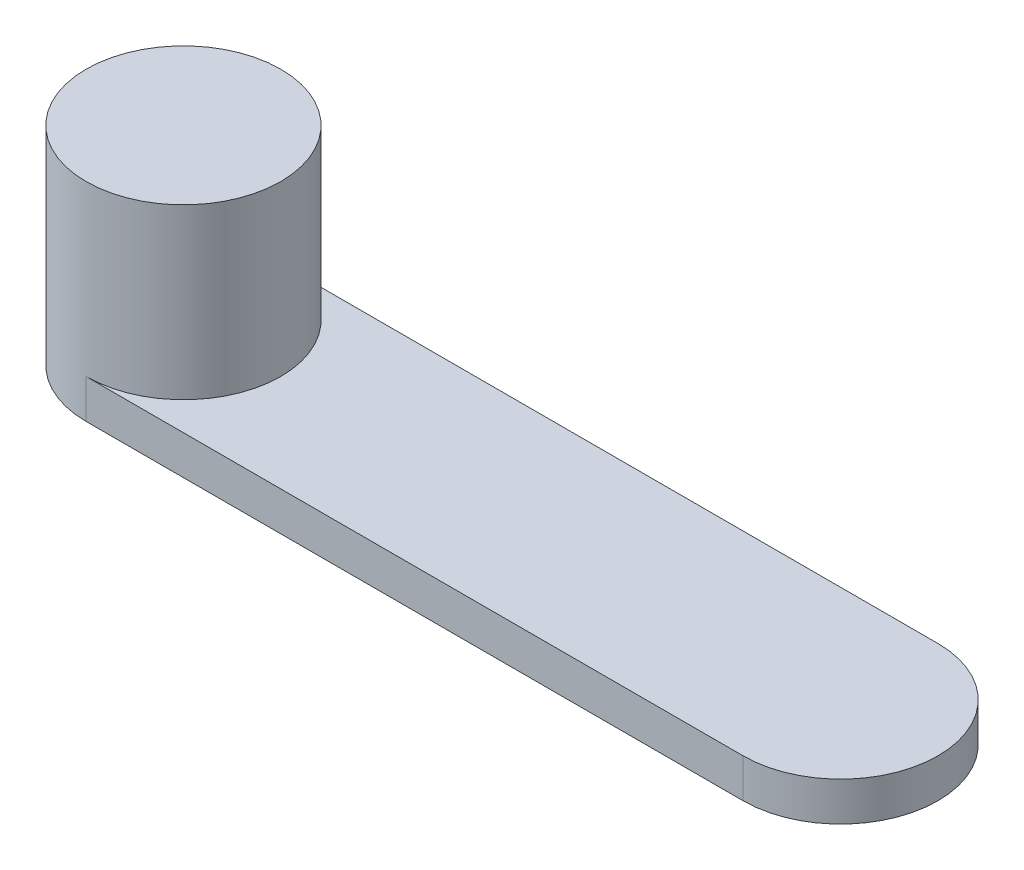
ISO-10303-21;
HEADER;
FILE_DESCRIPTION(('STEP AP214'),'2;1');
FILE_NAME('part.step','',(''),(''),'','','');
FILE_SCHEMA(('AUTOMOTIVE_DESIGN { 1 0 10303 214 1 1 1 1 }'));
ENDSEC;
DATA;
#1=APPLICATION_CONTEXT('core data for automotive mechanical design processes');
#2=APPLICATION_PROTOCOL_DEFINITION('international standard','automotive_design',2000,#1);
#3=PRODUCT_CONTEXT('',#1,'mechanical');
#4=PRODUCT('Part','Part','',(#3));
#5=PRODUCT_RELATED_PRODUCT_CATEGORY('part','',(#4));
#6=PRODUCT_DEFINITION_FORMATION('','',#4);
#7=PRODUCT_DEFINITION_CONTEXT('part definition',#1,'design');
#8=PRODUCT_DEFINITION('design','',#6,#7);
#9=PRODUCT_DEFINITION_SHAPE('','',#8);
#10=(LENGTH_UNIT() NAMED_UNIT(*) SI_UNIT(.MILLI.,.METRE.));
#11=(NAMED_UNIT(*) PLANE_ANGLE_UNIT() SI_UNIT($,.RADIAN.));
#12=(NAMED_UNIT(*) SI_UNIT($,.STERADIAN.) SOLID_ANGLE_UNIT());
#13=UNCERTAINTY_MEASURE_WITH_UNIT(LENGTH_MEASURE(1.E-05),#10,'distance_accuracy_value','');
#14=(GEOMETRIC_REPRESENTATION_CONTEXT(3) GLOBAL_UNCERTAINTY_ASSIGNED_CONTEXT((#13)) GLOBAL_UNIT_ASSIGNED_CONTEXT((#10,
#11,#12)) REPRESENTATION_CONTEXT('',''));
#15=CARTESIAN_POINT('',(0.,0.,0.));
#16=DIRECTION('',(0.,0.,1.));
#17=DIRECTION('',(1.,0.,0.));
#18=AXIS2_PLACEMENT_3D('',#15,#16,#17);
#19=CARTESIAN_POINT('',(67.5,8.,0.));
#20=DIRECTION('',(0.,-1.,0.));
#21=DIRECTION('',(0.,0.,-1.));
#22=AXIS2_PLACEMENT_3D('',#19,#20,#21);
#23=CYLINDRICAL_SURFACE('',#22,20.);
#24=CARTESIAN_POINT('',(67.5,0.,0.));
#25=DIRECTION('',(0.,1.,0.));
#26=DIRECTION('',(0.,0.,1.));
#27=AXIS2_PLACEMENT_3D('',#24,#25,#26);
#28=CIRCLE('',#27,20.);
#29=CARTESIAN_POINT('',(67.5,0.,20.));
#30=VERTEX_POINT('',#29);
#31=CARTESIAN_POINT('',(67.5,0.,-20.));
#32=VERTEX_POINT('',#31);
#33=EDGE_CURVE('E97',#30,#32,#28,.T.);
#34=ORIENTED_EDGE('',*,*,#33,.T.);
#35=DIRECTION('',(0.,-1.,0.));
#36=VECTOR('',#35,1.);
#37=CARTESIAN_POINT('',(67.5,8.,-20.));
#38=LINE('',#37,#36);
#39=CARTESIAN_POINT('',(67.5,8.,-20.));
#40=VERTEX_POINT('',#39);
#41=EDGE_CURVE('E11',#40,#32,#38,.T.);
#42=ORIENTED_EDGE('',*,*,#41,.F.);
#43=CARTESIAN_POINT('',(67.5,8.,0.));
#44=DIRECTION('',(0.,1.,0.));
#45=DIRECTION('',(0.,0.,1.));
#46=AXIS2_PLACEMENT_3D('',#43,#44,#45);
#47=CIRCLE('',#46,20.);
#48=CARTESIAN_POINT('',(67.5,8.,20.));
#49=VERTEX_POINT('',#48);
#50=EDGE_CURVE('E100',#49,#40,#47,.T.);
#51=ORIENTED_EDGE('',*,*,#50,.F.);
#52=DIRECTION('',(0.,-1.,0.));
#53=VECTOR('',#52,1.);
#54=CARTESIAN_POINT('',(67.5,8.,20.));
#55=LINE('',#54,#53);
#56=EDGE_CURVE('E85',#49,#30,#55,.T.);
#57=ORIENTED_EDGE('',*,*,#56,.T.);
#58=EDGE_LOOP('',(#34,#42,#51,#57));
#59=FACE_BOUND('',#58,.T.);
#60=ADVANCED_FACE('F36',(#59),#23,.T.);
#61=CARTESIAN_POINT('',(67.5,8.,-20.));
#62=DIRECTION('',(0.,0.,1.));
#63=DIRECTION('',(1.,0.,0.));
#64=AXIS2_PLACEMENT_3D('',#61,#62,#63);
#65=PLANE('',#64);
#66=DIRECTION('',(-1.,0.,0.));
#67=VECTOR('',#66,1.);
#68=CARTESIAN_POINT('',(67.5,0.,-20.));
#69=LINE('',#68,#67);
#70=CARTESIAN_POINT('',(-67.5,0.,-20.));
#71=VERTEX_POINT('',#70);
#72=EDGE_CURVE('E105',#32,#71,#69,.T.);
#73=ORIENTED_EDGE('',*,*,#72,.T.);
#74=DIRECTION('',(0.,-1.,0.));
#75=VECTOR('',#74,1.);
#76=CARTESIAN_POINT('',(-67.5,8.,-20.));
#77=LINE('',#76,#75);
#78=CARTESIAN_POINT('',(-67.5,8.,-20.));
#79=VERTEX_POINT('',#78);
#80=EDGE_CURVE('E44',#79,#71,#77,.T.);
#81=ORIENTED_EDGE('',*,*,#80,.F.);
#82=DIRECTION('',(-1.,0.,0.));
#83=VECTOR('',#82,1.);
#84=CARTESIAN_POINT('',(67.5,8.,-20.));
#85=LINE('',#84,#83);
#86=EDGE_CURVE('E81',#40,#79,#85,.T.);
#87=ORIENTED_EDGE('',*,*,#86,.F.);
#88=ORIENTED_EDGE('',*,*,#41,.T.);
#89=EDGE_LOOP('',(#73,#81,#87,#88));
#90=FACE_BOUND('',#89,.T.);
#91=ADVANCED_FACE('F114',(#90),#65,.F.);
#92=CARTESIAN_POINT('',(-67.5,8.,0.));
#93=DIRECTION('',(0.,-1.,0.));
#94=DIRECTION('',(0.,0.,-1.));
#95=AXIS2_PLACEMENT_3D('',#92,#93,#94);
#96=CYLINDRICAL_SURFACE('',#95,20.);
#97=CARTESIAN_POINT('',(-67.5,0.,0.));
#98=DIRECTION('',(0.,1.,0.));
#99=DIRECTION('',(0.,0.,1.));
#100=AXIS2_PLACEMENT_3D('',#97,#98,#99);
#101=CIRCLE('',#100,20.);
#102=CARTESIAN_POINT('',(-67.5,0.,20.));
#103=VERTEX_POINT('',#102);
#104=EDGE_CURVE('E71',#71,#103,#101,.T.);
#105=ORIENTED_EDGE('',*,*,#104,.T.);
#106=DIRECTION('',(0.,-1.,0.));
#107=VECTOR('',#106,1.);
#108=CARTESIAN_POINT('',(-67.5,8.,20.));
#109=LINE('',#108,#107);
#110=CARTESIAN_POINT('',(-67.5,8.,20.));
#111=VERTEX_POINT('',#110);
#112=EDGE_CURVE('E84',#111,#103,#109,.T.);
#113=ORIENTED_EDGE('',*,*,#112,.F.);
#114=CARTESIAN_POINT('',(-67.5,8.,0.));
#115=DIRECTION('',(0.,1.,0.));
#116=DIRECTION('',(0.,0.,1.));
#117=AXIS2_PLACEMENT_3D('',#114,#115,#116);
#118=CIRCLE('',#117,20.);
#119=EDGE_CURVE('E91',#111,#79,#118,.T.);
#120=ORIENTED_EDGE('',*,*,#119,.T.);
#121=ORIENTED_EDGE('',*,*,#80,.T.);
#122=EDGE_LOOP('',(#105,#113,#120,#121));
#123=FACE_BOUND('',#122,.T.);
#124=CARTESIAN_POINT('',(-67.5,42.68,0.));
#125=DIRECTION('',(0.,1.,0.));
#126=DIRECTION('',(0.,0.,1.));
#127=AXIS2_PLACEMENT_3D('',#124,#125,#126);
#128=CIRCLE('',#127,20.);
#129=CARTESIAN_POINT('',(-67.5,42.68,20.));
#130=VERTEX_POINT('',#129);
#131=EDGE_CURVE('E94',#130,#130,#128,.T.);
#132=ORIENTED_EDGE('',*,*,#131,.F.);
#133=EDGE_LOOP('',(#132));
#134=FACE_BOUND('',#133,.T.);
#135=ADVANCED_FACE('F89',(#123,#134),#96,.T.);
#136=CARTESIAN_POINT('',(67.5,8.,20.));
#137=DIRECTION('',(0.,0.,-1.));
#138=DIRECTION('',(-1.,0.,0.));
#139=AXIS2_PLACEMENT_3D('',#136,#137,#138);
#140=PLANE('',#139);
#141=DIRECTION('',(1.,0.,0.));
#142=VECTOR('',#141,1.);
#143=CARTESIAN_POINT('',(67.5,0.,20.));
#144=LINE('',#143,#142);
#145=EDGE_CURVE('E76',#103,#30,#144,.T.);
#146=ORIENTED_EDGE('',*,*,#145,.T.);
#147=ORIENTED_EDGE('',*,*,#56,.F.);
#148=DIRECTION('',(1.,0.,0.));
#149=VECTOR('',#148,1.);
#150=CARTESIAN_POINT('',(67.5,8.,20.));
#151=LINE('',#150,#149);
#152=EDGE_CURVE('E52',#111,#49,#151,.T.);
#153=ORIENTED_EDGE('',*,*,#152,.F.);
#154=ORIENTED_EDGE('',*,*,#112,.T.);
#155=EDGE_LOOP('',(#146,#147,#153,#154));
#156=FACE_BOUND('',#155,.T.);
#157=ADVANCED_FACE('F83',(#156),#140,.F.);
#158=CARTESIAN_POINT('',(67.5,8.,0.));
#159=DIRECTION('',(0.,1.,0.));
#160=DIRECTION('',(0.,0.,1.));
#161=AXIS2_PLACEMENT_3D('',#158,#159,#160);
#162=PLANE('',#161);
#163=ORIENTED_EDGE('',*,*,#119,.F.);
#164=ORIENTED_EDGE('',*,*,#152,.T.);
#165=ORIENTED_EDGE('',*,*,#50,.T.);
#166=ORIENTED_EDGE('',*,*,#86,.T.);
#167=EDGE_LOOP('',(#163,#164,#165,#166));
#168=FACE_BOUND('',#167,.T.);
#169=ADVANCED_FACE('F93',(#168),#162,.T.);
#170=CARTESIAN_POINT('',(67.5,0.,0.));
#171=DIRECTION('',(0.,1.,0.));
#172=DIRECTION('',(0.,0.,1.));
#173=AXIS2_PLACEMENT_3D('',#170,#171,#172);
#174=PLANE('',#173);
#175=ORIENTED_EDGE('',*,*,#33,.F.);
#176=ORIENTED_EDGE('',*,*,#145,.F.);
#177=ORIENTED_EDGE('',*,*,#104,.F.);
#178=ORIENTED_EDGE('',*,*,#72,.F.);
#179=EDGE_LOOP('',(#175,#176,#177,#178));
#180=FACE_BOUND('',#179,.T.);
#181=ADVANCED_FACE('F111',(#180),#174,.F.);
#182=CARTESIAN_POINT('',(-67.5,42.68,0.));
#183=DIRECTION('',(0.,1.,0.));
#184=DIRECTION('',(0.,0.,1.));
#185=AXIS2_PLACEMENT_3D('',#182,#183,#184);
#186=PLANE('',#185);
#187=ORIENTED_EDGE('',*,*,#131,.T.);
#188=EDGE_LOOP('',(#187));
#189=FACE_BOUND('',#188,.T.);
#190=ADVANCED_FACE('F126',(#189),#186,.T.);
#191=CLOSED_SHELL('',(#60,#91,#135,#157,#169,#181,#190));
#192=MANIFOLD_SOLID_BREP('B2',#191);
#193=ADVANCED_BREP_SHAPE_REPRESENTATION('',(#18,#192),#14);
#194=SHAPE_DEFINITION_REPRESENTATION(#9,#193);
ENDSEC;
END-ISO-10303-21;
